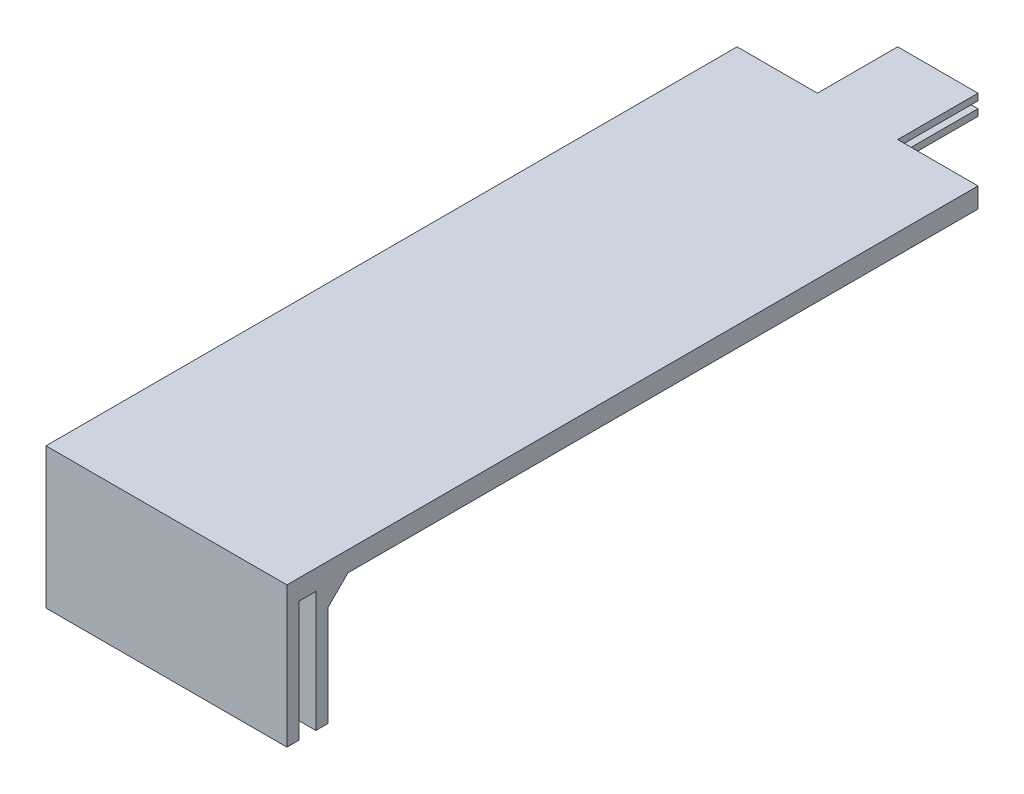
ISO-10303-21;
HEADER;
FILE_DESCRIPTION(('STEP AP214'),'2;1');
FILE_NAME('part.step','',(''),(''),'','','');
FILE_SCHEMA(('AUTOMOTIVE_DESIGN { 1 0 10303 214 1 1 1 1 }'));
ENDSEC;
DATA;
#1=APPLICATION_CONTEXT('core data for automotive mechanical design processes');
#2=APPLICATION_PROTOCOL_DEFINITION('international standard','automotive_design',2000,#1);
#3=PRODUCT_CONTEXT('',#1,'mechanical');
#4=PRODUCT('Part','Part','',(#3));
#5=PRODUCT_RELATED_PRODUCT_CATEGORY('part','',(#4));
#6=PRODUCT_DEFINITION_FORMATION('','',#4);
#7=PRODUCT_DEFINITION_CONTEXT('part definition',#1,'design');
#8=PRODUCT_DEFINITION('design','',#6,#7);
#9=PRODUCT_DEFINITION_SHAPE('','',#8);
#10=(LENGTH_UNIT() NAMED_UNIT(*) SI_UNIT(.MILLI.,.METRE.));
#11=(NAMED_UNIT(*) PLANE_ANGLE_UNIT() SI_UNIT($,.RADIAN.));
#12=(NAMED_UNIT(*) SI_UNIT($,.STERADIAN.) SOLID_ANGLE_UNIT());
#13=UNCERTAINTY_MEASURE_WITH_UNIT(LENGTH_MEASURE(1.E-05),#10,'distance_accuracy_value','');
#14=(GEOMETRIC_REPRESENTATION_CONTEXT(3) GLOBAL_UNCERTAINTY_ASSIGNED_CONTEXT((#13)) GLOBAL_UNIT_ASSIGNED_CONTEXT((#10,
#11,#12)) REPRESENTATION_CONTEXT('',''));
#15=CARTESIAN_POINT('',(0.,0.,0.));
#16=DIRECTION('',(0.,0.,1.));
#17=DIRECTION('',(1.,0.,0.));
#18=AXIS2_PLACEMENT_3D('',#15,#16,#17);
#19=CARTESIAN_POINT('',(0.,0.,-161.9));
#20=DIRECTION('',(0.,0.,1.));
#21=DIRECTION('',(1.,0.,0.));
#22=AXIS2_PLACEMENT_3D('',#19,#20,#21);
#23=PLANE('',#22);
#24=DIRECTION('',(0.,1.,0.));
#25=VECTOR('',#24,1.);
#26=CARTESIAN_POINT('',(-20.,0.,-161.9));
#27=LINE('',#26,#25);
#28=CARTESIAN_POINT('',(-20.,0.,-161.9));
#29=VERTEX_POINT('',#28);
#30=CARTESIAN_POINT('',(-20.,1.65,-161.9));
#31=VERTEX_POINT('',#30);
#32=EDGE_CURVE('E199',#29,#31,#27,.T.);
#33=ORIENTED_EDGE('',*,*,#32,.F.);
#34=DIRECTION('',(-1.,0.,0.));
#35=VECTOR('',#34,1.);
#36=CARTESIAN_POINT('',(20.,0.,-161.9));
#37=LINE('',#36,#35);
#38=CARTESIAN_POINT('',(-40.,0.,-161.9));
#39=VERTEX_POINT('',#38);
#40=EDGE_CURVE('E237',#29,#39,#37,.T.);
#41=ORIENTED_EDGE('',*,*,#40,.T.);
#42=DIRECTION('',(0.,1.,0.));
#43=VECTOR('',#42,1.);
#44=CARTESIAN_POINT('',(-40.,0.,-161.9));
#45=LINE('',#44,#43);
#46=CARTESIAN_POINT('',(-40.,5.,-161.9));
#47=VERTEX_POINT('',#46);
#48=EDGE_CURVE('E240',#39,#47,#45,.T.);
#49=ORIENTED_EDGE('',*,*,#48,.T.);
#50=DIRECTION('',(1.,0.,0.));
#51=VECTOR('',#50,1.);
#52=CARTESIAN_POINT('',(20.,5.,-161.9));
#53=LINE('',#52,#51);
#54=CARTESIAN_POINT('',(-20.,5.,-161.9));
#55=VERTEX_POINT('',#54);
#56=EDGE_CURVE('E244',#47,#55,#53,.T.);
#57=ORIENTED_EDGE('',*,*,#56,.T.);
#58=DIRECTION('',(0.,1.,0.));
#59=VECTOR('',#58,1.);
#60=CARTESIAN_POINT('',(-20.,0.,-161.9));
#61=LINE('',#60,#59);
#62=CARTESIAN_POINT('',(-20.,3.35,-161.9));
#63=VERTEX_POINT('',#62);
#64=EDGE_CURVE('E212',#63,#55,#61,.T.);
#65=ORIENTED_EDGE('',*,*,#64,.F.);
#66=DIRECTION('',(-1.,0.,0.));
#67=VECTOR('',#66,1.);
#68=CARTESIAN_POINT('',(0.,3.35,-161.9));
#69=LINE('',#68,#67);
#70=CARTESIAN_POINT('',(0.,3.35,-161.9));
#71=VERTEX_POINT('',#70);
#72=EDGE_CURVE('E202',#71,#63,#69,.T.);
#73=ORIENTED_EDGE('',*,*,#72,.F.);
#74=DIRECTION('',(0.,1.,0.));
#75=VECTOR('',#74,1.);
#76=CARTESIAN_POINT('',(0.,0.,-161.9));
#77=LINE('',#76,#75);
#78=CARTESIAN_POINT('',(0.,5.,-161.9));
#79=VERTEX_POINT('',#78);
#80=EDGE_CURVE('E200',#71,#79,#77,.T.);
#81=ORIENTED_EDGE('',*,*,#80,.T.);
#82=CARTESIAN_POINT('',(20.,5.,-161.9));
#83=VERTEX_POINT('',#82);
#84=EDGE_CURVE('E243',#79,#83,#53,.T.);
#85=ORIENTED_EDGE('',*,*,#84,.T.);
#86=DIRECTION('',(0.,-1.,0.));
#87=VECTOR('',#86,1.);
#88=CARTESIAN_POINT('',(20.,0.,-161.9));
#89=LINE('',#88,#87);
#90=CARTESIAN_POINT('',(20.,0.,-161.9));
#91=VERTEX_POINT('',#90);
#92=EDGE_CURVE('E234',#83,#91,#89,.T.);
#93=ORIENTED_EDGE('',*,*,#92,.T.);
#94=CARTESIAN_POINT('',(0.,0.,-161.9));
#95=VERTEX_POINT('',#94);
#96=EDGE_CURVE('E238',#91,#95,#37,.T.);
#97=ORIENTED_EDGE('',*,*,#96,.T.);
#98=DIRECTION('',(0.,1.,0.));
#99=VECTOR('',#98,1.);
#100=CARTESIAN_POINT('',(0.,0.,-161.9));
#101=LINE('',#100,#99);
#102=CARTESIAN_POINT('',(0.,1.65,-161.9));
#103=VERTEX_POINT('',#102);
#104=EDGE_CURVE('E195',#95,#103,#101,.T.);
#105=ORIENTED_EDGE('',*,*,#104,.T.);
#106=DIRECTION('',(1.,0.,0.));
#107=VECTOR('',#106,1.);
#108=CARTESIAN_POINT('',(0.,1.65,-161.9));
#109=LINE('',#108,#107);
#110=EDGE_CURVE('E674',#31,#103,#109,.T.);
#111=ORIENTED_EDGE('',*,*,#110,.F.);
#112=EDGE_LOOP('',(#33,#41,#49,#57,#65,#73,#81,#85,#93,#97,#105,#111));
#113=FACE_BOUND('',#112,.T.);
#114=ADVANCED_FACE('F42',(#113),#23,.F.);
#115=CARTESIAN_POINT('',(0.,-30.,0.));
#116=DIRECTION('',(0.,-1.,0.));
#117=DIRECTION('',(0.,0.,-1.));
#118=AXIS2_PLACEMENT_3D('',#115,#116,#117);
#119=PLANE('',#118);
#120=DIRECTION('',(1.,0.,0.));
#121=VECTOR('',#120,1.);
#122=CARTESIAN_POINT('',(20.,-30.,3.));
#123=LINE('',#122,#121);
#124=CARTESIAN_POINT('',(-40.,-30.,2.99999999999999));
#125=VERTEX_POINT('',#124);
#126=CARTESIAN_POINT('',(20.,-30.,3.));
#127=VERTEX_POINT('',#126);
#128=EDGE_CURVE('E275',#125,#127,#123,.T.);
#129=ORIENTED_EDGE('',*,*,#128,.F.);
#130=DIRECTION('',(0.,0.,1.));
#131=VECTOR('',#130,1.);
#132=CARTESIAN_POINT('',(-40.,-30.,0.));
#133=LINE('',#132,#131);
#134=CARTESIAN_POINT('',(-40.,-30.,0.));
#135=VERTEX_POINT('',#134);
#136=EDGE_CURVE('E264',#135,#125,#133,.T.);
#137=ORIENTED_EDGE('',*,*,#136,.F.);
#138=DIRECTION('',(1.,0.,0.));
#139=VECTOR('',#138,1.);
#140=CARTESIAN_POINT('',(20.,-30.,0.));
#141=LINE('',#140,#139);
#142=CARTESIAN_POINT('',(20.,-30.,0.));
#143=VERTEX_POINT('',#142);
#144=EDGE_CURVE('E293',#135,#143,#141,.T.);
#145=ORIENTED_EDGE('',*,*,#144,.T.);
#146=DIRECTION('',(0.,0.,1.));
#147=VECTOR('',#146,1.);
#148=CARTESIAN_POINT('',(20.,-30.,0.));
#149=LINE('',#148,#147);
#150=EDGE_CURVE('E288',#143,#127,#149,.T.);
#151=ORIENTED_EDGE('',*,*,#150,.T.);
#152=EDGE_LOOP('',(#129,#137,#145,#151));
#153=FACE_BOUND('',#152,.T.);
#154=ADVANCED_FACE('F322',(#153),#119,.T.);
#155=CARTESIAN_POINT('',(20.,5.,0.));
#156=DIRECTION('',(-1.,0.,0.));
#157=DIRECTION('',(0.,0.,1.));
#158=AXIS2_PLACEMENT_3D('',#155,#156,#157);
#159=PLANE('',#158);
#160=DIRECTION('',(0.,0.,1.));
#161=VECTOR('',#160,1.);
#162=CARTESIAN_POINT('',(20.,0.,7.2));
#163=LINE('',#162,#161);
#164=CARTESIAN_POINT('',(20.,0.,3.));
#165=VERTEX_POINT('',#164);
#166=CARTESIAN_POINT('',(20.,0.,7.2));
#167=VERTEX_POINT('',#166);
#168=EDGE_CURVE('E271',#165,#167,#163,.T.);
#169=ORIENTED_EDGE('',*,*,#168,.F.);
#170=DIRECTION('',(0.,-1.,0.));
#171=VECTOR('',#170,1.);
#172=CARTESIAN_POINT('',(20.,0.,3.));
#173=LINE('',#172,#171);
#174=EDGE_CURVE('E283',#165,#127,#173,.T.);
#175=ORIENTED_EDGE('',*,*,#174,.T.);
#176=ORIENTED_EDGE('',*,*,#150,.F.);
#177=DIRECTION('',(0.,-1.,0.));
#178=VECTOR('',#177,1.);
#179=CARTESIAN_POINT('',(20.,5.,0.));
#180=LINE('',#179,#178);
#181=CARTESIAN_POINT('',(20.,-5.00000000000003,0.));
#182=VERTEX_POINT('',#181);
#183=EDGE_CURVE('E299',#182,#143,#180,.T.);
#184=ORIENTED_EDGE('',*,*,#183,.F.);
#185=DIRECTION('',(0.,-0.707106781186552,0.707106781186544));
#186=VECTOR('',#185,1.);
#187=CARTESIAN_POINT('',(20.,0.,-5.00000000000002));
#188=LINE('',#187,#186);
#189=CARTESIAN_POINT('',(20.,0.,-4.99999999999998));
#190=VERTEX_POINT('',#189);
#191=EDGE_CURVE('E51',#182,#190,#188,.F.);
#192=ORIENTED_EDGE('',*,*,#191,.T.);
#193=DIRECTION('',(0.,0.,-1.));
#194=VECTOR('',#193,1.);
#195=CARTESIAN_POINT('',(20.,0.,0.));
#196=LINE('',#195,#194);
#197=EDGE_CURVE('E301',#190,#91,#196,.T.);
#198=ORIENTED_EDGE('',*,*,#197,.T.);
#199=ORIENTED_EDGE('',*,*,#92,.F.);
#200=DIRECTION('',(0.,0.,-1.));
#201=VECTOR('',#200,1.);
#202=CARTESIAN_POINT('',(20.,5.,0.));
#203=LINE('',#202,#201);
#204=CARTESIAN_POINT('',(20.,5.,10.2));
#205=VERTEX_POINT('',#204);
#206=EDGE_CURVE('E304',#205,#83,#203,.T.);
#207=ORIENTED_EDGE('',*,*,#206,.F.);
#208=DIRECTION('',(0.,-1.,0.));
#209=VECTOR('',#208,1.);
#210=CARTESIAN_POINT('',(20.,5.,10.2));
#211=LINE('',#210,#209);
#212=CARTESIAN_POINT('',(20.,-30.,10.2));
#213=VERTEX_POINT('',#212);
#214=EDGE_CURVE('E298',#205,#213,#211,.T.);
#215=ORIENTED_EDGE('',*,*,#214,.T.);
#216=CARTESIAN_POINT('',(20.,-30.,7.2));
#217=VERTEX_POINT('',#216);
#218=EDGE_CURVE('E286',#217,#213,#149,.T.);
#219=ORIENTED_EDGE('',*,*,#218,.F.);
#220=DIRECTION('',(0.,-1.,0.));
#221=VECTOR('',#220,1.);
#222=CARTESIAN_POINT('',(20.,0.,7.2));
#223=LINE('',#222,#221);
#224=EDGE_CURVE('E280',#167,#217,#223,.T.);
#225=ORIENTED_EDGE('',*,*,#224,.F.);
#226=EDGE_LOOP('',(#169,#175,#176,#184,#192,#198,#199,#207,#215,#219,#225));
#227=FACE_BOUND('',#226,.T.);
#228=ADVANCED_FACE('F320',(#227),#159,.F.);
#229=CARTESIAN_POINT('',(0.,5.,0.));
#230=DIRECTION('',(0.,-1.,0.));
#231=DIRECTION('',(0.,0.,-1.));
#232=AXIS2_PLACEMENT_3D('',#229,#230,#231);
#233=PLANE('',#232);
#234=ORIENTED_EDGE('',*,*,#206,.T.);
#235=ORIENTED_EDGE('',*,*,#84,.F.);
#236=DIRECTION('',(0.,0.,1.));
#237=VECTOR('',#236,1.);
#238=CARTESIAN_POINT('',(0.,5.,-181.9));
#239=LINE('',#238,#237);
#240=CARTESIAN_POINT('',(0.,5.,-181.9));
#241=VERTEX_POINT('',#240);
#242=EDGE_CURVE('E217',#241,#79,#239,.T.);
#243=ORIENTED_EDGE('',*,*,#242,.F.);
#244=DIRECTION('',(1.,0.,0.));
#245=VECTOR('',#244,1.);
#246=CARTESIAN_POINT('',(0.,5.,-181.9));
#247=LINE('',#246,#245);
#248=CARTESIAN_POINT('',(-20.,5.,-181.9));
#249=VERTEX_POINT('',#248);
#250=EDGE_CURVE('E216',#249,#241,#247,.T.);
#251=ORIENTED_EDGE('',*,*,#250,.F.);
#252=DIRECTION('',(0.,0.,1.));
#253=VECTOR('',#252,1.);
#254=CARTESIAN_POINT('',(-20.,5.,-181.9));
#255=LINE('',#254,#253);
#256=EDGE_CURVE('E225',#249,#55,#255,.T.);
#257=ORIENTED_EDGE('',*,*,#256,.T.);
#258=ORIENTED_EDGE('',*,*,#56,.F.);
#259=DIRECTION('',(0.,0.,-1.));
#260=VECTOR('',#259,1.);
#261=CARTESIAN_POINT('',(-40.,5.,0.));
#262=LINE('',#261,#260);
#263=CARTESIAN_POINT('',(-40.,5.,10.2));
#264=VERTEX_POINT('',#263);
#265=EDGE_CURVE('E258',#264,#47,#262,.T.);
#266=ORIENTED_EDGE('',*,*,#265,.F.);
#267=DIRECTION('',(-1.,0.,0.));
#268=VECTOR('',#267,1.);
#269=CARTESIAN_POINT('',(20.,5.,10.2));
#270=LINE('',#269,#268);
#271=EDGE_CURVE('E296',#205,#264,#270,.T.);
#272=ORIENTED_EDGE('',*,*,#271,.F.);
#273=EDGE_LOOP('',(#234,#235,#243,#251,#257,#258,#266,#272));
#274=FACE_BOUND('',#273,.T.);
#275=ADVANCED_FACE('F349',(#274),#233,.F.);
#276=CARTESIAN_POINT('',(0.,0.,0.));
#277=DIRECTION('',(0.,-1.,0.));
#278=DIRECTION('',(0.,0.,-1.));
#279=AXIS2_PLACEMENT_3D('',#276,#277,#278);
#280=PLANE('',#279);
#281=ORIENTED_EDGE('',*,*,#197,.F.);
#282=DIRECTION('',(-1.,0.,0.));
#283=VECTOR('',#282,1.);
#284=CARTESIAN_POINT('',(-40.,0.,-4.99999999999998));
#285=LINE('',#284,#283);
#286=CARTESIAN_POINT('',(-40.,0.,-4.99999999999998));
#287=VERTEX_POINT('',#286);
#288=EDGE_CURVE('E64',#190,#287,#285,.T.);
#289=ORIENTED_EDGE('',*,*,#288,.T.);
#290=DIRECTION('',(0.,0.,1.));
#291=VECTOR('',#290,1.);
#292=CARTESIAN_POINT('',(-40.,0.,0.));
#293=LINE('',#292,#291);
#294=EDGE_CURVE('E260',#39,#287,#293,.T.);
#295=ORIENTED_EDGE('',*,*,#294,.F.);
#296=ORIENTED_EDGE('',*,*,#40,.F.);
#297=DIRECTION('',(0.,0.,1.));
#298=VECTOR('',#297,1.);
#299=CARTESIAN_POINT('',(-20.,0.,-181.9));
#300=LINE('',#299,#298);
#301=CARTESIAN_POINT('',(-20.,0.,-181.9));
#302=VERTEX_POINT('',#301);
#303=EDGE_CURVE('E673',#302,#29,#300,.T.);
#304=ORIENTED_EDGE('',*,*,#303,.F.);
#305=DIRECTION('',(-1.,0.,0.));
#306=VECTOR('',#305,1.);
#307=CARTESIAN_POINT('',(0.,0.,-181.9));
#308=LINE('',#307,#306);
#309=CARTESIAN_POINT('',(0.,0.,-181.9));
#310=VERTEX_POINT('',#309);
#311=EDGE_CURVE('E191',#310,#302,#308,.T.);
#312=ORIENTED_EDGE('',*,*,#311,.F.);
#313=DIRECTION('',(0.,0.,1.));
#314=VECTOR('',#313,1.);
#315=CARTESIAN_POINT('',(0.,0.,-181.9));
#316=LINE('',#315,#314);
#317=EDGE_CURVE('E204',#310,#95,#316,.T.);
#318=ORIENTED_EDGE('',*,*,#317,.T.);
#319=ORIENTED_EDGE('',*,*,#96,.F.);
#320=EDGE_LOOP('',(#281,#289,#295,#296,#304,#312,#318,#319));
#321=FACE_BOUND('',#320,.T.);
#322=ADVANCED_FACE('F355',(#321),#280,.T.);
#323=CARTESIAN_POINT('',(20.,5.,0.));
#324=DIRECTION('',(0.,0.,-1.));
#325=DIRECTION('',(-1.,0.,0.));
#326=AXIS2_PLACEMENT_3D('',#323,#324,#325);
#327=PLANE('',#326);
#328=DIRECTION('',(0.,-1.,0.));
#329=VECTOR('',#328,1.);
#330=CARTESIAN_POINT('',(-40.,0.,0.));
#331=LINE('',#330,#329);
#332=CARTESIAN_POINT('',(-40.,-5.00000000000003,0.));
#333=VERTEX_POINT('',#332);
#334=EDGE_CURVE('E262',#333,#135,#331,.T.);
#335=ORIENTED_EDGE('',*,*,#334,.F.);
#336=DIRECTION('',(1.,0.,0.));
#337=VECTOR('',#336,1.);
#338=CARTESIAN_POINT('',(20.,-5.00000000000003,0.));
#339=LINE('',#338,#337);
#340=EDGE_CURVE('E307',#333,#182,#339,.T.);
#341=ORIENTED_EDGE('',*,*,#340,.T.);
#342=ORIENTED_EDGE('',*,*,#183,.T.);
#343=ORIENTED_EDGE('',*,*,#144,.F.);
#344=EDGE_LOOP('',(#335,#341,#342,#343));
#345=FACE_BOUND('',#344,.T.);
#346=ADVANCED_FACE('F314',(#345),#327,.T.);
#347=CARTESIAN_POINT('',(20.,5.,10.2));
#348=DIRECTION('',(0.,0.,1.));
#349=DIRECTION('',(1.,0.,0.));
#350=AXIS2_PLACEMENT_3D('',#347,#348,#349);
#351=PLANE('',#350);
#352=ORIENTED_EDGE('',*,*,#271,.T.);
#353=DIRECTION('',(0.,1.,0.));
#354=VECTOR('',#353,1.);
#355=CARTESIAN_POINT('',(-40.,0.,10.2));
#356=LINE('',#355,#354);
#357=CARTESIAN_POINT('',(-40.,-30.,10.2));
#358=VERTEX_POINT('',#357);
#359=EDGE_CURVE('E255',#358,#264,#356,.T.);
#360=ORIENTED_EDGE('',*,*,#359,.F.);
#361=DIRECTION('',(-1.,0.,0.));
#362=VECTOR('',#361,1.);
#363=CARTESIAN_POINT('',(20.,-30.,10.2));
#364=LINE('',#363,#362);
#365=EDGE_CURVE('E291',#213,#358,#364,.T.);
#366=ORIENTED_EDGE('',*,*,#365,.F.);
#367=ORIENTED_EDGE('',*,*,#214,.F.);
#368=EDGE_LOOP('',(#352,#360,#366,#367));
#369=FACE_BOUND('',#368,.T.);
#370=ADVANCED_FACE('F345',(#369),#351,.T.);
#371=DIRECTION('',(-1.,0.,0.));
#372=VECTOR('',#371,1.);
#373=CARTESIAN_POINT('',(20.,-30.,7.2));
#374=LINE('',#373,#372);
#375=CARTESIAN_POINT('',(-40.,-30.,7.2));
#376=VERTEX_POINT('',#375);
#377=EDGE_CURVE('E270',#217,#376,#374,.T.);
#378=ORIENTED_EDGE('',*,*,#377,.F.);
#379=ORIENTED_EDGE('',*,*,#218,.T.);
#380=ORIENTED_EDGE('',*,*,#365,.T.);
#381=DIRECTION('',(0.,0.,1.));
#382=VECTOR('',#381,1.);
#383=CARTESIAN_POINT('',(-40.,-30.,0.));
#384=LINE('',#383,#382);
#385=EDGE_CURVE('E252',#376,#358,#384,.T.);
#386=ORIENTED_EDGE('',*,*,#385,.F.);
#387=EDGE_LOOP('',(#378,#379,#380,#386));
#388=FACE_BOUND('',#387,.T.);
#389=ADVANCED_FACE('F339',(#388),#119,.T.);
#390=CARTESIAN_POINT('',(20.,0.,3.));
#391=DIRECTION('',(0.,0.,-1.));
#392=DIRECTION('',(-1.,0.,0.));
#393=AXIS2_PLACEMENT_3D('',#390,#391,#392);
#394=PLANE('',#393);
#395=ORIENTED_EDGE('',*,*,#128,.T.);
#396=ORIENTED_EDGE('',*,*,#174,.F.);
#397=DIRECTION('',(1.,0.,0.));
#398=VECTOR('',#397,1.);
#399=CARTESIAN_POINT('',(20.,0.,3.));
#400=LINE('',#399,#398);
#401=CARTESIAN_POINT('',(-40.,0.,2.99999999999999));
#402=VERTEX_POINT('',#401);
#403=EDGE_CURVE('E277',#402,#165,#400,.T.);
#404=ORIENTED_EDGE('',*,*,#403,.F.);
#405=DIRECTION('',(0.,1.,0.));
#406=VECTOR('',#405,1.);
#407=CARTESIAN_POINT('',(-40.,0.,2.99999999999999));
#408=LINE('',#407,#406);
#409=EDGE_CURVE('E267',#125,#402,#408,.T.);
#410=ORIENTED_EDGE('',*,*,#409,.F.);
#411=EDGE_LOOP('',(#395,#396,#404,#410));
#412=FACE_BOUND('',#411,.T.);
#413=ADVANCED_FACE('F329',(#412),#394,.F.);
#414=CARTESIAN_POINT('',(20.,0.,7.2));
#415=DIRECTION('',(0.,0.,1.));
#416=DIRECTION('',(1.,0.,0.));
#417=AXIS2_PLACEMENT_3D('',#414,#415,#416);
#418=PLANE('',#417);
#419=ORIENTED_EDGE('',*,*,#377,.T.);
#420=DIRECTION('',(0.,1.,0.));
#421=VECTOR('',#420,1.);
#422=CARTESIAN_POINT('',(-40.,0.,7.2));
#423=LINE('',#422,#421);
#424=CARTESIAN_POINT('',(-40.,0.,7.2));
#425=VERTEX_POINT('',#424);
#426=EDGE_CURVE('E249',#376,#425,#423,.T.);
#427=ORIENTED_EDGE('',*,*,#426,.T.);
#428=DIRECTION('',(-1.,0.,0.));
#429=VECTOR('',#428,1.);
#430=CARTESIAN_POINT('',(20.,0.,7.2));
#431=LINE('',#430,#429);
#432=EDGE_CURVE('E274',#167,#425,#431,.T.);
#433=ORIENTED_EDGE('',*,*,#432,.F.);
#434=ORIENTED_EDGE('',*,*,#224,.T.);
#435=EDGE_LOOP('',(#419,#427,#433,#434));
#436=FACE_BOUND('',#435,.T.);
#437=ADVANCED_FACE('F336',(#436),#418,.F.);
#438=CARTESIAN_POINT('',(0.,0.,0.));
#439=DIRECTION('',(0.,1.,0.));
#440=DIRECTION('',(0.,0.,1.));
#441=AXIS2_PLACEMENT_3D('',#438,#439,#440);
#442=PLANE('',#441);
#443=ORIENTED_EDGE('',*,*,#168,.T.);
#444=ORIENTED_EDGE('',*,*,#432,.T.);
#445=DIRECTION('',(0.,0.,1.));
#446=VECTOR('',#445,1.);
#447=CARTESIAN_POINT('',(-40.,0.,0.));
#448=LINE('',#447,#446);
#449=EDGE_CURVE('E246',#402,#425,#448,.T.);
#450=ORIENTED_EDGE('',*,*,#449,.F.);
#451=ORIENTED_EDGE('',*,*,#403,.T.);
#452=EDGE_LOOP('',(#443,#444,#450,#451));
#453=FACE_BOUND('',#452,.T.);
#454=ADVANCED_FACE('F331',(#453),#442,.F.);
#455=CARTESIAN_POINT('',(-40.,0.,0.));
#456=DIRECTION('',(-1.,0.,0.));
#457=DIRECTION('',(0.,0.,1.));
#458=AXIS2_PLACEMENT_3D('',#455,#456,#457);
#459=PLANE('',#458);
#460=ORIENTED_EDGE('',*,*,#449,.T.);
#461=ORIENTED_EDGE('',*,*,#426,.F.);
#462=ORIENTED_EDGE('',*,*,#385,.T.);
#463=ORIENTED_EDGE('',*,*,#359,.T.);
#464=ORIENTED_EDGE('',*,*,#265,.T.);
#465=ORIENTED_EDGE('',*,*,#48,.F.);
#466=ORIENTED_EDGE('',*,*,#294,.T.);
#467=DIRECTION('',(0.,0.707106781186552,-0.707106781186544));
#468=VECTOR('',#467,1.);
#469=CARTESIAN_POINT('',(-40.,-5.00000000000004,0.));
#470=LINE('',#469,#468);
#471=EDGE_CURVE('E11',#287,#333,#470,.F.);
#472=ORIENTED_EDGE('',*,*,#471,.T.);
#473=ORIENTED_EDGE('',*,*,#334,.T.);
#474=ORIENTED_EDGE('',*,*,#136,.T.);
#475=ORIENTED_EDGE('',*,*,#409,.T.);
#476=EDGE_LOOP('',(#460,#461,#462,#463,#464,#465,#466,#472,#473,#474,#475));
#477=FACE_BOUND('',#476,.T.);
#478=ADVANCED_FACE('F326',(#477),#459,.T.);
#479=CARTESIAN_POINT('',(0.,0.,-181.9));
#480=DIRECTION('',(1.,0.,0.));
#481=DIRECTION('',(0.,0.,-1.));
#482=AXIS2_PLACEMENT_3D('',#479,#480,#481);
#483=PLANE('',#482);
#484=ORIENTED_EDGE('',*,*,#80,.F.);
#485=DIRECTION('',(0.,0.,1.));
#486=VECTOR('',#485,1.);
#487=CARTESIAN_POINT('',(0.,3.35,-181.9));
#488=LINE('',#487,#486);
#489=CARTESIAN_POINT('',(0.,3.35,-181.9));
#490=VERTEX_POINT('',#489);
#491=EDGE_CURVE('E231',#490,#71,#488,.T.);
#492=ORIENTED_EDGE('',*,*,#491,.F.);
#493=DIRECTION('',(0.,1.,0.));
#494=VECTOR('',#493,1.);
#495=CARTESIAN_POINT('',(0.,0.,-181.9));
#496=LINE('',#495,#494);
#497=EDGE_CURVE('E208',#490,#241,#496,.T.);
#498=ORIENTED_EDGE('',*,*,#497,.T.);
#499=ORIENTED_EDGE('',*,*,#242,.T.);
#500=EDGE_LOOP('',(#484,#492,#498,#499));
#501=FACE_BOUND('',#500,.T.);
#502=ADVANCED_FACE('F370',(#501),#483,.T.);
#503=CARTESIAN_POINT('',(0.,3.35,-181.9));
#504=DIRECTION('',(0.,1.,0.));
#505=DIRECTION('',(0.,0.,1.));
#506=AXIS2_PLACEMENT_3D('',#503,#504,#505);
#507=PLANE('',#506);
#508=ORIENTED_EDGE('',*,*,#72,.T.);
#509=DIRECTION('',(0.,0.,1.));
#510=VECTOR('',#509,1.);
#511=CARTESIAN_POINT('',(-20.,3.35,-181.9));
#512=LINE('',#511,#510);
#513=CARTESIAN_POINT('',(-20.,3.35,-181.9));
#514=VERTEX_POINT('',#513);
#515=EDGE_CURVE('E228',#514,#63,#512,.T.);
#516=ORIENTED_EDGE('',*,*,#515,.F.);
#517=DIRECTION('',(-1.,0.,0.));
#518=VECTOR('',#517,1.);
#519=CARTESIAN_POINT('',(0.,3.35,-181.9));
#520=LINE('',#519,#518);
#521=EDGE_CURVE('E211',#490,#514,#520,.T.);
#522=ORIENTED_EDGE('',*,*,#521,.F.);
#523=ORIENTED_EDGE('',*,*,#491,.T.);
#524=EDGE_LOOP('',(#508,#516,#522,#523));
#525=FACE_BOUND('',#524,.T.);
#526=ADVANCED_FACE('F467',(#525),#507,.F.);
#527=CARTESIAN_POINT('',(-20.,0.,-181.9));
#528=DIRECTION('',(1.,0.,0.));
#529=DIRECTION('',(0.,0.,-1.));
#530=AXIS2_PLACEMENT_3D('',#527,#528,#529);
#531=PLANE('',#530);
#532=ORIENTED_EDGE('',*,*,#64,.T.);
#533=ORIENTED_EDGE('',*,*,#256,.F.);
#534=DIRECTION('',(0.,1.,0.));
#535=VECTOR('',#534,1.);
#536=CARTESIAN_POINT('',(-20.,0.,-181.9));
#537=LINE('',#536,#535);
#538=EDGE_CURVE('E214',#514,#249,#537,.T.);
#539=ORIENTED_EDGE('',*,*,#538,.F.);
#540=ORIENTED_EDGE('',*,*,#515,.T.);
#541=EDGE_LOOP('',(#532,#533,#539,#540));
#542=FACE_BOUND('',#541,.T.);
#543=ADVANCED_FACE('F456',(#542),#531,.F.);
#544=CARTESIAN_POINT('',(0.,0.,-181.9));
#545=DIRECTION('',(0.,0.,-1.));
#546=DIRECTION('',(-1.,0.,0.));
#547=AXIS2_PLACEMENT_3D('',#544,#545,#546);
#548=PLANE('',#547);
#549=ORIENTED_EDGE('',*,*,#497,.F.);
#550=ORIENTED_EDGE('',*,*,#521,.T.);
#551=ORIENTED_EDGE('',*,*,#538,.T.);
#552=ORIENTED_EDGE('',*,*,#250,.T.);
#553=EDGE_LOOP('',(#549,#550,#551,#552));
#554=FACE_BOUND('',#553,.T.);
#555=ADVANCED_FACE('F446',(#554),#548,.T.);
#556=CARTESIAN_POINT('',(-20.,0.,-181.9));
#557=DIRECTION('',(1.,0.,0.));
#558=DIRECTION('',(0.,0.,-1.));
#559=AXIS2_PLACEMENT_3D('',#556,#557,#558);
#560=PLANE('',#559);
#561=ORIENTED_EDGE('',*,*,#32,.T.);
#562=DIRECTION('',(0.,0.,1.));
#563=VECTOR('',#562,1.);
#564=CARTESIAN_POINT('',(-20.,1.65,-181.9));
#565=LINE('',#564,#563);
#566=CARTESIAN_POINT('',(-20.,1.65,-181.9));
#567=VERTEX_POINT('',#566);
#568=EDGE_CURVE('E178',#567,#31,#565,.T.);
#569=ORIENTED_EDGE('',*,*,#568,.F.);
#570=DIRECTION('',(0.,1.,0.));
#571=VECTOR('',#570,1.);
#572=CARTESIAN_POINT('',(-20.,0.,-181.9));
#573=LINE('',#572,#571);
#574=EDGE_CURVE('E186',#302,#567,#573,.T.);
#575=ORIENTED_EDGE('',*,*,#574,.F.);
#576=ORIENTED_EDGE('',*,*,#303,.T.);
#577=EDGE_LOOP('',(#561,#569,#575,#576));
#578=FACE_BOUND('',#577,.T.);
#579=ADVANCED_FACE('F197',(#578),#560,.F.);
#580=CARTESIAN_POINT('',(0.,1.65,-181.9));
#581=DIRECTION('',(0.,-1.,0.));
#582=DIRECTION('',(1.,0.,0.));
#583=AXIS2_PLACEMENT_3D('',#580,#581,#582);
#584=PLANE('',#583);
#585=ORIENTED_EDGE('',*,*,#110,.T.);
#586=DIRECTION('',(0.,0.,1.));
#587=VECTOR('',#586,1.);
#588=CARTESIAN_POINT('',(0.,1.65,-181.9));
#589=LINE('',#588,#587);
#590=CARTESIAN_POINT('',(0.,1.65,-181.9));
#591=VERTEX_POINT('',#590);
#592=EDGE_CURVE('E181',#591,#103,#589,.T.);
#593=ORIENTED_EDGE('',*,*,#592,.F.);
#594=DIRECTION('',(1.,0.,0.));
#595=VECTOR('',#594,1.);
#596=CARTESIAN_POINT('',(0.,1.65,-181.9));
#597=LINE('',#596,#595);
#598=EDGE_CURVE('E173',#567,#591,#597,.T.);
#599=ORIENTED_EDGE('',*,*,#598,.F.);
#600=ORIENTED_EDGE('',*,*,#568,.T.);
#601=EDGE_LOOP('',(#585,#593,#599,#600));
#602=FACE_BOUND('',#601,.T.);
#603=ADVANCED_FACE('F176',(#602),#584,.F.);
#604=CARTESIAN_POINT('',(0.,0.,-181.9));
#605=DIRECTION('',(1.,0.,0.));
#606=DIRECTION('',(0.,0.,-1.));
#607=AXIS2_PLACEMENT_3D('',#604,#605,#606);
#608=PLANE('',#607);
#609=ORIENTED_EDGE('',*,*,#104,.F.);
#610=ORIENTED_EDGE('',*,*,#317,.F.);
#611=DIRECTION('',(0.,1.,0.));
#612=VECTOR('',#611,1.);
#613=CARTESIAN_POINT('',(0.,0.,-181.9));
#614=LINE('',#613,#612);
#615=EDGE_CURVE('E185',#310,#591,#614,.T.);
#616=ORIENTED_EDGE('',*,*,#615,.T.);
#617=ORIENTED_EDGE('',*,*,#592,.T.);
#618=EDGE_LOOP('',(#609,#610,#616,#617));
#619=FACE_BOUND('',#618,.T.);
#620=ADVANCED_FACE('F360',(#619),#608,.T.);
#621=CARTESIAN_POINT('',(0.,0.,-181.9));
#622=DIRECTION('',(0.,0.,-1.));
#623=DIRECTION('',(-1.,0.,0.));
#624=AXIS2_PLACEMENT_3D('',#621,#622,#623);
#625=PLANE('',#624);
#626=ORIENTED_EDGE('',*,*,#574,.T.);
#627=ORIENTED_EDGE('',*,*,#598,.T.);
#628=ORIENTED_EDGE('',*,*,#615,.F.);
#629=ORIENTED_EDGE('',*,*,#311,.T.);
#630=EDGE_LOOP('',(#626,#627,#628,#629));
#631=FACE_BOUND('',#630,.T.);
#632=ADVANCED_FACE('F189',(#631),#625,.T.);
#633=CARTESIAN_POINT('',(20.,-5.00000000000003,0.));
#634=DIRECTION('',(0.,-0.707106781186544,-0.707106781186552));
#635=DIRECTION('',(-1.,0.,0.));
#636=AXIS2_PLACEMENT_3D('',#633,#634,#635);
#637=PLANE('',#636);
#638=ORIENTED_EDGE('',*,*,#471,.F.);
#639=ORIENTED_EDGE('',*,*,#288,.F.);
#640=ORIENTED_EDGE('',*,*,#191,.F.);
#641=ORIENTED_EDGE('',*,*,#340,.F.);
#642=EDGE_LOOP('',(#638,#639,#640,#641));
#643=FACE_BOUND('',#642,.T.);
#644=ADVANCED_FACE('F45',(#643),#637,.T.);
#645=CLOSED_SHELL('',(#114,#154,#228,#275,#322,#346,#370,#389,#413,#437,#454,#478,#502,#526,
#543,#555,#579,#603,#620,#632,#644));
#646=MANIFOLD_SOLID_BREP('B2',#645);
#647=ADVANCED_BREP_SHAPE_REPRESENTATION('',(#18,#646),#14);
#648=SHAPE_DEFINITION_REPRESENTATION(#9,#647);
ENDSEC;
END-ISO-10303-21;
